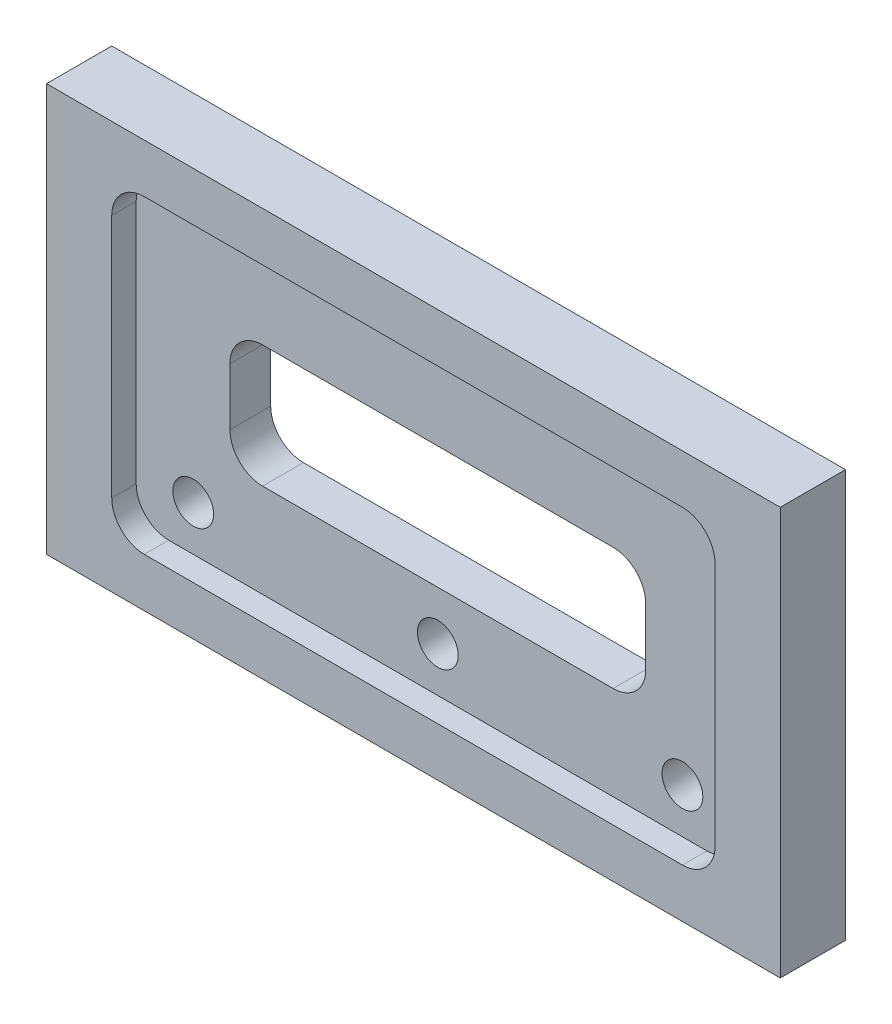
ISO-10303-21;
HEADER;
FILE_DESCRIPTION(('STEP AP214'),'2;1');
FILE_NAME('part.step','',(''),(''),'','','');
FILE_SCHEMA(('AUTOMOTIVE_DESIGN { 1 0 10303 214 1 1 1 1 }'));
ENDSEC;
DATA;
#1=APPLICATION_CONTEXT('core data for automotive mechanical design processes');
#2=APPLICATION_PROTOCOL_DEFINITION('international standard','automotive_design',2000,#1);
#3=PRODUCT_CONTEXT('',#1,'mechanical');
#4=PRODUCT('Part','Part','',(#3));
#5=PRODUCT_RELATED_PRODUCT_CATEGORY('part','',(#4));
#6=PRODUCT_DEFINITION_FORMATION('','',#4);
#7=PRODUCT_DEFINITION_CONTEXT('part definition',#1,'design');
#8=PRODUCT_DEFINITION('design','',#6,#7);
#9=PRODUCT_DEFINITION_SHAPE('','',#8);
#10=(LENGTH_UNIT() NAMED_UNIT(*) SI_UNIT(.MILLI.,.METRE.));
#11=(NAMED_UNIT(*) PLANE_ANGLE_UNIT() SI_UNIT($,.RADIAN.));
#12=(NAMED_UNIT(*) SI_UNIT($,.STERADIAN.) SOLID_ANGLE_UNIT());
#13=UNCERTAINTY_MEASURE_WITH_UNIT(LENGTH_MEASURE(1.E-05),#10,'distance_accuracy_value','');
#14=(GEOMETRIC_REPRESENTATION_CONTEXT(3) GLOBAL_UNCERTAINTY_ASSIGNED_CONTEXT((#13)) GLOBAL_UNIT_ASSIGNED_CONTEXT((#10,
#11,#12)) REPRESENTATION_CONTEXT('',''));
#15=CARTESIAN_POINT('',(0.,0.,0.));
#16=DIRECTION('',(0.,0.,1.));
#17=DIRECTION('',(1.,0.,0.));
#18=AXIS2_PLACEMENT_3D('',#15,#16,#17);
#19=CARTESIAN_POINT('',(0.,0.,2.5));
#20=DIRECTION('',(0.,0.,-1.));
#21=DIRECTION('',(-1.,0.,0.));
#22=AXIS2_PLACEMENT_3D('',#19,#20,#21);
#23=PLANE('',#22);
#24=CARTESIAN_POINT('',(-15.,-6.75,2.5));
#25=DIRECTION('',(0.,0.,1.));
#26=DIRECTION('',(1.,0.,0.));
#27=AXIS2_PLACEMENT_3D('',#24,#25,#26);
#28=CIRCLE('',#27,1.24999999999999);
#29=CARTESIAN_POINT('',(-13.75,-6.75,2.5));
#30=VERTEX_POINT('',#29);
#31=EDGE_CURVE('E547',#30,#30,#28,.T.);
#32=ORIENTED_EDGE('',*,*,#31,.F.);
#33=EDGE_LOOP('',(#32));
#34=FACE_BOUND('',#33,.T.);
#35=CARTESIAN_POINT('',(0.,-6.75,2.5));
#36=DIRECTION('',(0.,0.,1.));
#37=DIRECTION('',(1.,0.,0.));
#38=AXIS2_PLACEMENT_3D('',#35,#36,#37);
#39=CIRCLE('',#38,1.24999999999999);
#40=CARTESIAN_POINT('',(1.24999999999999,-6.75,2.5));
#41=VERTEX_POINT('',#40);
#42=EDGE_CURVE('E549',#41,#41,#39,.T.);
#43=ORIENTED_EDGE('',*,*,#42,.F.);
#44=EDGE_LOOP('',(#43));
#45=FACE_BOUND('',#44,.T.);
#46=DIRECTION('',(-1.,0.,0.));
#47=VECTOR('',#46,1.);
#48=CARTESIAN_POINT('',(-10.75,3.75,2.5));
#49=LINE('',#48,#47);
#50=CARTESIAN_POINT('',(10.75,3.75,2.5));
#51=VERTEX_POINT('',#50);
#52=CARTESIAN_POINT('',(-10.75,3.75,2.5));
#53=VERTEX_POINT('',#52);
#54=EDGE_CURVE('E211',#51,#53,#49,.T.);
#55=ORIENTED_EDGE('',*,*,#54,.F.);
#56=CARTESIAN_POINT('',(10.75,1.75,2.5));
#57=DIRECTION('',(0.,0.,1.));
#58=DIRECTION('',(-1.,0.,0.));
#59=AXIS2_PLACEMENT_3D('',#56,#57,#58);
#60=CIRCLE('',#59,2.);
#61=CARTESIAN_POINT('',(12.75,1.74999999999999,2.5));
#62=VERTEX_POINT('',#61);
#63=EDGE_CURVE('E56',#62,#51,#60,.T.);
#64=ORIENTED_EDGE('',*,*,#63,.F.);
#65=DIRECTION('',(0.,1.,0.));
#66=VECTOR('',#65,1.);
#67=CARTESIAN_POINT('',(12.75,-1.74999999999999,2.5));
#68=LINE('',#67,#66);
#69=CARTESIAN_POINT('',(12.75,-1.75,2.5));
#70=VERTEX_POINT('',#69);
#71=EDGE_CURVE('E188',#70,#62,#68,.T.);
#72=ORIENTED_EDGE('',*,*,#71,.F.);
#73=CARTESIAN_POINT('',(10.75,-1.75,2.5));
#74=DIRECTION('',(0.,0.,1.));
#75=DIRECTION('',(1.,0.,0.));
#76=AXIS2_PLACEMENT_3D('',#73,#74,#75);
#77=CIRCLE('',#76,2.);
#78=CARTESIAN_POINT('',(10.75,-3.75,2.5));
#79=VERTEX_POINT('',#78);
#80=EDGE_CURVE('E191',#79,#70,#77,.T.);
#81=ORIENTED_EDGE('',*,*,#80,.F.);
#82=DIRECTION('',(1.,0.,0.));
#83=VECTOR('',#82,1.);
#84=CARTESIAN_POINT('',(-10.75,-3.75,2.5));
#85=LINE('',#84,#83);
#86=CARTESIAN_POINT('',(-10.75,-3.75,2.5));
#87=VERTEX_POINT('',#86);
#88=EDGE_CURVE('E222',#87,#79,#85,.T.);
#89=ORIENTED_EDGE('',*,*,#88,.F.);
#90=CARTESIAN_POINT('',(-10.75,-1.75,2.5));
#91=DIRECTION('',(0.,0.,1.));
#92=DIRECTION('',(-1.,0.,0.));
#93=AXIS2_PLACEMENT_3D('',#90,#91,#92);
#94=CIRCLE('',#93,2.);
#95=CARTESIAN_POINT('',(-12.75,-1.74999999999999,2.5));
#96=VERTEX_POINT('',#95);
#97=EDGE_CURVE('E219',#96,#87,#94,.T.);
#98=ORIENTED_EDGE('',*,*,#97,.F.);
#99=DIRECTION('',(0.,-1.,0.));
#100=VECTOR('',#99,1.);
#101=CARTESIAN_POINT('',(-12.75,-1.74999999999999,2.5));
#102=LINE('',#101,#100);
#103=CARTESIAN_POINT('',(-12.75,1.74999999999999,2.5));
#104=VERTEX_POINT('',#103);
#105=EDGE_CURVE('E216',#104,#96,#102,.T.);
#106=ORIENTED_EDGE('',*,*,#105,.F.);
#107=CARTESIAN_POINT('',(-10.75,1.75,2.5));
#108=DIRECTION('',(0.,0.,1.));
#109=DIRECTION('',(-1.,0.,0.));
#110=AXIS2_PLACEMENT_3D('',#107,#108,#109);
#111=CIRCLE('',#110,2.);
#112=EDGE_CURVE('E213',#53,#104,#111,.T.);
#113=ORIENTED_EDGE('',*,*,#112,.F.);
#114=EDGE_LOOP('',(#55,#64,#72,#81,#89,#98,#106,#113));
#115=FACE_BOUND('',#114,.T.);
#116=DIRECTION('',(-1.,0.,0.));
#117=VECTOR('',#116,1.);
#118=CARTESIAN_POINT('',(-18.5,9.5,2.5));
#119=LINE('',#118,#117);
#120=CARTESIAN_POINT('',(16.5,9.5,2.5));
#121=VERTEX_POINT('',#120);
#122=CARTESIAN_POINT('',(-16.5,9.5,2.5));
#123=VERTEX_POINT('',#122);
#124=EDGE_CURVE('E244',#121,#123,#119,.T.);
#125=ORIENTED_EDGE('',*,*,#124,.T.);
#126=CARTESIAN_POINT('',(-16.5,7.5,2.5));
#127=DIRECTION('',(0.,0.,-1.));
#128=DIRECTION('',(-1.,0.,0.));
#129=AXIS2_PLACEMENT_3D('',#126,#127,#128);
#130=CIRCLE('',#129,2.);
#131=CARTESIAN_POINT('',(-18.5,7.5,2.5));
#132=VERTEX_POINT('',#131);
#133=EDGE_CURVE('E310',#123,#132,#130,.F.);
#134=ORIENTED_EDGE('',*,*,#133,.T.);
#135=DIRECTION('',(0.,-1.,0.));
#136=VECTOR('',#135,1.);
#137=CARTESIAN_POINT('',(-18.5,-9.5,2.5));
#138=LINE('',#137,#136);
#139=CARTESIAN_POINT('',(-18.5,-7.5,2.5));
#140=VERTEX_POINT('',#139);
#141=EDGE_CURVE('E248',#132,#140,#138,.T.);
#142=ORIENTED_EDGE('',*,*,#141,.T.);
#143=CARTESIAN_POINT('',(-16.5,-7.5,2.5));
#144=DIRECTION('',(0.,0.,-1.));
#145=DIRECTION('',(-1.,0.,0.));
#146=AXIS2_PLACEMENT_3D('',#143,#144,#145);
#147=CIRCLE('',#146,2.);
#148=CARTESIAN_POINT('',(-16.5,-9.5,2.5));
#149=VERTEX_POINT('',#148);
#150=EDGE_CURVE('E304',#140,#149,#147,.F.);
#151=ORIENTED_EDGE('',*,*,#150,.T.);
#152=DIRECTION('',(1.,0.,0.));
#153=VECTOR('',#152,1.);
#154=CARTESIAN_POINT('',(-18.5,-9.5,2.5));
#155=LINE('',#154,#153);
#156=CARTESIAN_POINT('',(16.5,-9.5,2.5));
#157=VERTEX_POINT('',#156);
#158=EDGE_CURVE('E251',#149,#157,#155,.T.);
#159=ORIENTED_EDGE('',*,*,#158,.T.);
#160=CARTESIAN_POINT('',(16.5,-7.5,2.5));
#161=DIRECTION('',(0.,0.,-1.));
#162=DIRECTION('',(-1.,0.,0.));
#163=AXIS2_PLACEMENT_3D('',#160,#161,#162);
#164=CIRCLE('',#163,2.);
#165=CARTESIAN_POINT('',(18.5,-7.5,2.5));
#166=VERTEX_POINT('',#165);
#167=EDGE_CURVE('E306',#157,#166,#164,.F.);
#168=ORIENTED_EDGE('',*,*,#167,.T.);
#169=DIRECTION('',(0.,1.,0.));
#170=VECTOR('',#169,1.);
#171=CARTESIAN_POINT('',(18.5,-9.5,2.5));
#172=LINE('',#171,#170);
#173=CARTESIAN_POINT('',(18.5,7.5,2.5));
#174=VERTEX_POINT('',#173);
#175=EDGE_CURVE('E241',#166,#174,#172,.T.);
#176=ORIENTED_EDGE('',*,*,#175,.T.);
#177=CARTESIAN_POINT('',(16.5,7.5,2.5));
#178=DIRECTION('',(0.,0.,-1.));
#179=DIRECTION('',(-1.,0.,0.));
#180=AXIS2_PLACEMENT_3D('',#177,#178,#179);
#181=CIRCLE('',#180,2.);
#182=EDGE_CURVE('E308',#174,#121,#181,.F.);
#183=ORIENTED_EDGE('',*,*,#182,.T.);
#184=EDGE_LOOP('',(#125,#134,#142,#151,#159,#168,#176,#183));
#185=FACE_BOUND('',#184,.T.);
#186=CARTESIAN_POINT('',(15.,-6.75,2.5));
#187=DIRECTION('',(0.,0.,1.));
#188=DIRECTION('',(1.,0.,0.));
#189=AXIS2_PLACEMENT_3D('',#186,#187,#188);
#190=CIRCLE('',#189,1.24999999999999);
#191=CARTESIAN_POINT('',(16.25,-6.75,2.5));
#192=VERTEX_POINT('',#191);
#193=EDGE_CURVE('E556',#192,#192,#190,.T.);
#194=ORIENTED_EDGE('',*,*,#193,.F.);
#195=EDGE_LOOP('',(#194));
#196=FACE_BOUND('',#195,.T.);
#197=ADVANCED_FACE('F33',(#34,#45,#115,#185,#196),#23,.F.);
#198=CARTESIAN_POINT('',(22.5,-12.5,4.));
#199=DIRECTION('',(-1.,0.,0.));
#200=DIRECTION('',(0.,-1.,0.));
#201=AXIS2_PLACEMENT_3D('',#198,#199,#200);
#202=PLANE('',#201);
#203=DIRECTION('',(0.,1.,0.));
#204=VECTOR('',#203,1.);
#205=CARTESIAN_POINT('',(22.5,-12.5,0.));
#206=LINE('',#205,#204);
#207=CARTESIAN_POINT('',(22.5,-12.5,0.));
#208=VERTEX_POINT('',#207);
#209=CARTESIAN_POINT('',(22.5,12.5,0.));
#210=VERTEX_POINT('',#209);
#211=EDGE_CURVE('E254',#208,#210,#206,.T.);
#212=ORIENTED_EDGE('',*,*,#211,.T.);
#213=DIRECTION('',(0.,0.,-1.));
#214=VECTOR('',#213,1.);
#215=CARTESIAN_POINT('',(22.5,12.5,4.));
#216=LINE('',#215,#214);
#217=CARTESIAN_POINT('',(22.5,12.5,4.));
#218=VERTEX_POINT('',#217);
#219=EDGE_CURVE('E291',#218,#210,#216,.T.);
#220=ORIENTED_EDGE('',*,*,#219,.F.);
#221=DIRECTION('',(0.,1.,0.));
#222=VECTOR('',#221,1.);
#223=CARTESIAN_POINT('',(22.5,-12.5,4.));
#224=LINE('',#223,#222);
#225=CARTESIAN_POINT('',(22.5,-12.5,4.));
#226=VERTEX_POINT('',#225);
#227=EDGE_CURVE('E265',#226,#218,#224,.T.);
#228=ORIENTED_EDGE('',*,*,#227,.F.);
#229=DIRECTION('',(0.,0.,-1.));
#230=VECTOR('',#229,1.);
#231=CARTESIAN_POINT('',(22.5,-12.5,4.));
#232=LINE('',#231,#230);
#233=EDGE_CURVE('E275',#226,#208,#232,.T.);
#234=ORIENTED_EDGE('',*,*,#233,.T.);
#235=EDGE_LOOP('',(#212,#220,#228,#234));
#236=FACE_BOUND('',#235,.T.);
#237=ADVANCED_FACE('F373',(#236),#202,.F.);
#238=CARTESIAN_POINT('',(-22.5,12.5,4.));
#239=DIRECTION('',(0.,-1.,0.));
#240=DIRECTION('',(0.,0.,-1.));
#241=AXIS2_PLACEMENT_3D('',#238,#239,#240);
#242=PLANE('',#241);
#243=DIRECTION('',(-1.,0.,0.));
#244=VECTOR('',#243,1.);
#245=CARTESIAN_POINT('',(-22.5,12.5,0.));
#246=LINE('',#245,#244);
#247=CARTESIAN_POINT('',(-22.5,12.5,0.));
#248=VERTEX_POINT('',#247);
#249=EDGE_CURVE('E278',#210,#248,#246,.T.);
#250=ORIENTED_EDGE('',*,*,#249,.T.);
#251=DIRECTION('',(0.,0.,-1.));
#252=VECTOR('',#251,1.);
#253=CARTESIAN_POINT('',(-22.5,12.5,4.));
#254=LINE('',#253,#252);
#255=CARTESIAN_POINT('',(-22.5,12.5,4.));
#256=VERTEX_POINT('',#255);
#257=EDGE_CURVE('E288',#256,#248,#254,.T.);
#258=ORIENTED_EDGE('',*,*,#257,.F.);
#259=DIRECTION('',(-1.,0.,0.));
#260=VECTOR('',#259,1.);
#261=CARTESIAN_POINT('',(-22.5,12.5,4.));
#262=LINE('',#261,#260);
#263=EDGE_CURVE('E268',#218,#256,#262,.T.);
#264=ORIENTED_EDGE('',*,*,#263,.F.);
#265=ORIENTED_EDGE('',*,*,#219,.T.);
#266=EDGE_LOOP('',(#250,#258,#264,#265));
#267=FACE_BOUND('',#266,.T.);
#268=ADVANCED_FACE('F379',(#267),#242,.F.);
#269=CARTESIAN_POINT('',(-22.5,-12.5,4.));
#270=DIRECTION('',(1.,0.,0.));
#271=DIRECTION('',(0.,0.,-1.));
#272=AXIS2_PLACEMENT_3D('',#269,#270,#271);
#273=PLANE('',#272);
#274=DIRECTION('',(0.,-1.,0.));
#275=VECTOR('',#274,1.);
#276=CARTESIAN_POINT('',(-22.5,-12.5,0.));
#277=LINE('',#276,#275);
#278=CARTESIAN_POINT('',(-22.5,-12.5,0.));
#279=VERTEX_POINT('',#278);
#280=EDGE_CURVE('E280',#248,#279,#277,.T.);
#281=ORIENTED_EDGE('',*,*,#280,.T.);
#282=DIRECTION('',(0.,0.,-1.));
#283=VECTOR('',#282,1.);
#284=CARTESIAN_POINT('',(-22.5,-12.5,4.));
#285=LINE('',#284,#283);
#286=CARTESIAN_POINT('',(-22.5,-12.5,4.));
#287=VERTEX_POINT('',#286);
#288=EDGE_CURVE('E285',#287,#279,#285,.T.);
#289=ORIENTED_EDGE('',*,*,#288,.F.);
#290=DIRECTION('',(0.,-1.,0.));
#291=VECTOR('',#290,1.);
#292=CARTESIAN_POINT('',(-22.5,-12.5,4.));
#293=LINE('',#292,#291);
#294=EDGE_CURVE('E271',#256,#287,#293,.T.);
#295=ORIENTED_EDGE('',*,*,#294,.F.);
#296=ORIENTED_EDGE('',*,*,#257,.T.);
#297=EDGE_LOOP('',(#281,#289,#295,#296));
#298=FACE_BOUND('',#297,.T.);
#299=ADVANCED_FACE('F402',(#298),#273,.F.);
#300=CARTESIAN_POINT('',(-22.5,-12.5,4.));
#301=DIRECTION('',(0.,1.,0.));
#302=DIRECTION('',(0.,0.,1.));
#303=AXIS2_PLACEMENT_3D('',#300,#301,#302);
#304=PLANE('',#303);
#305=DIRECTION('',(1.,0.,0.));
#306=VECTOR('',#305,1.);
#307=CARTESIAN_POINT('',(-22.5,-12.5,0.));
#308=LINE('',#307,#306);
#309=EDGE_CURVE('E269',#279,#208,#308,.T.);
#310=ORIENTED_EDGE('',*,*,#309,.T.);
#311=ORIENTED_EDGE('',*,*,#233,.F.);
#312=DIRECTION('',(1.,0.,0.));
#313=VECTOR('',#312,1.);
#314=CARTESIAN_POINT('',(-22.5,-12.5,4.));
#315=LINE('',#314,#313);
#316=EDGE_CURVE('E273',#287,#226,#315,.T.);
#317=ORIENTED_EDGE('',*,*,#316,.F.);
#318=ORIENTED_EDGE('',*,*,#288,.T.);
#319=EDGE_LOOP('',(#310,#311,#317,#318));
#320=FACE_BOUND('',#319,.T.);
#321=ADVANCED_FACE('F396',(#320),#304,.F.);
#322=CARTESIAN_POINT('',(0.,0.,4.));
#323=DIRECTION('',(0.,0.,-1.));
#324=DIRECTION('',(-1.,0.,0.));
#325=AXIS2_PLACEMENT_3D('',#322,#323,#324);
#326=PLANE('',#325);
#327=DIRECTION('',(-1.,0.,0.));
#328=VECTOR('',#327,1.);
#329=CARTESIAN_POINT('',(-18.5,9.5,4.));
#330=LINE('',#329,#328);
#331=CARTESIAN_POINT('',(16.5,9.5,4.));
#332=VERTEX_POINT('',#331);
#333=CARTESIAN_POINT('',(-16.5,9.5,4.));
#334=VERTEX_POINT('',#333);
#335=EDGE_CURVE('E257',#332,#334,#330,.T.);
#336=ORIENTED_EDGE('',*,*,#335,.F.);
#337=CARTESIAN_POINT('',(16.5,7.5,4.));
#338=DIRECTION('',(0.,0.,-1.));
#339=DIRECTION('',(-1.,0.,0.));
#340=AXIS2_PLACEMENT_3D('',#337,#338,#339);
#341=CIRCLE('',#340,2.);
#342=CARTESIAN_POINT('',(18.5,7.5,4.));
#343=VERTEX_POINT('',#342);
#344=EDGE_CURVE('E324',#332,#343,#341,.T.);
#345=ORIENTED_EDGE('',*,*,#344,.T.);
#346=DIRECTION('',(0.,1.,0.));
#347=VECTOR('',#346,1.);
#348=CARTESIAN_POINT('',(18.5,-9.5,4.));
#349=LINE('',#348,#347);
#350=CARTESIAN_POINT('',(18.5,-7.5,4.));
#351=VERTEX_POINT('',#350);
#352=EDGE_CURVE('E229',#351,#343,#349,.T.);
#353=ORIENTED_EDGE('',*,*,#352,.F.);
#354=CARTESIAN_POINT('',(16.5,-7.5,4.));
#355=DIRECTION('',(0.,0.,-1.));
#356=DIRECTION('',(-1.,0.,0.));
#357=AXIS2_PLACEMENT_3D('',#354,#355,#356);
#358=CIRCLE('',#357,2.);
#359=CARTESIAN_POINT('',(16.5,-9.5,4.));
#360=VERTEX_POINT('',#359);
#361=EDGE_CURVE('E41',#351,#360,#358,.T.);
#362=ORIENTED_EDGE('',*,*,#361,.T.);
#363=DIRECTION('',(1.,0.,0.));
#364=VECTOR('',#363,1.);
#365=CARTESIAN_POINT('',(-18.5,-9.5,4.));
#366=LINE('',#365,#364);
#367=CARTESIAN_POINT('',(-16.5,-9.5,4.));
#368=VERTEX_POINT('',#367);
#369=EDGE_CURVE('E245',#368,#360,#366,.T.);
#370=ORIENTED_EDGE('',*,*,#369,.F.);
#371=CARTESIAN_POINT('',(-16.5,-7.5,4.));
#372=DIRECTION('',(0.,0.,-1.));
#373=DIRECTION('',(-1.,0.,0.));
#374=AXIS2_PLACEMENT_3D('',#371,#372,#373);
#375=CIRCLE('',#374,2.);
#376=CARTESIAN_POINT('',(-18.5,-7.5,4.));
#377=VERTEX_POINT('',#376);
#378=EDGE_CURVE('E11',#368,#377,#375,.T.);
#379=ORIENTED_EDGE('',*,*,#378,.T.);
#380=DIRECTION('',(0.,-1.,0.));
#381=VECTOR('',#380,1.);
#382=CARTESIAN_POINT('',(-18.5,-9.5,4.));
#383=LINE('',#382,#381);
#384=CARTESIAN_POINT('',(-18.5,7.5,4.));
#385=VERTEX_POINT('',#384);
#386=EDGE_CURVE('E260',#385,#377,#383,.T.);
#387=ORIENTED_EDGE('',*,*,#386,.F.);
#388=CARTESIAN_POINT('',(-16.5,7.5,4.));
#389=DIRECTION('',(0.,0.,-1.));
#390=DIRECTION('',(-1.,0.,0.));
#391=AXIS2_PLACEMENT_3D('',#388,#389,#390);
#392=CIRCLE('',#391,2.);
#393=EDGE_CURVE('E322',#385,#334,#392,.T.);
#394=ORIENTED_EDGE('',*,*,#393,.T.);
#395=EDGE_LOOP('',(#336,#345,#353,#362,#370,#379,#387,#394));
#396=FACE_BOUND('',#395,.T.);
#397=ORIENTED_EDGE('',*,*,#227,.T.);
#398=ORIENTED_EDGE('',*,*,#263,.T.);
#399=ORIENTED_EDGE('',*,*,#294,.T.);
#400=ORIENTED_EDGE('',*,*,#316,.T.);
#401=EDGE_LOOP('',(#397,#398,#399,#400));
#402=FACE_BOUND('',#401,.T.);
#403=ADVANCED_FACE('F329',(#396,#402),#326,.F.);
#404=CARTESIAN_POINT('',(0.,0.,0.));
#405=DIRECTION('',(0.,0.,-1.));
#406=DIRECTION('',(-1.,0.,0.));
#407=AXIS2_PLACEMENT_3D('',#404,#405,#406);
#408=PLANE('',#407);
#409=CARTESIAN_POINT('',(-15.,-6.75,0.));
#410=DIRECTION('',(0.,0.,1.));
#411=DIRECTION('',(1.,0.,0.));
#412=AXIS2_PLACEMENT_3D('',#409,#410,#411);
#413=CIRCLE('',#412,1.25);
#414=CARTESIAN_POINT('',(-13.75,-6.75,0.));
#415=VERTEX_POINT('',#414);
#416=EDGE_CURVE('E545',#415,#415,#413,.T.);
#417=ORIENTED_EDGE('',*,*,#416,.T.);
#418=EDGE_LOOP('',(#417));
#419=FACE_BOUND('',#418,.T.);
#420=CARTESIAN_POINT('',(0.,-6.75,0.));
#421=DIRECTION('',(0.,0.,1.));
#422=DIRECTION('',(1.,0.,0.));
#423=AXIS2_PLACEMENT_3D('',#420,#421,#422);
#424=CIRCLE('',#423,1.25);
#425=CARTESIAN_POINT('',(1.25,-6.75,0.));
#426=VERTEX_POINT('',#425);
#427=EDGE_CURVE('E554',#426,#426,#424,.T.);
#428=ORIENTED_EDGE('',*,*,#427,.T.);
#429=EDGE_LOOP('',(#428));
#430=FACE_BOUND('',#429,.T.);
#431=CARTESIAN_POINT('',(15.,-6.75,0.));
#432=DIRECTION('',(0.,0.,1.));
#433=DIRECTION('',(1.,0.,0.));
#434=AXIS2_PLACEMENT_3D('',#431,#432,#433);
#435=CIRCLE('',#434,1.25);
#436=CARTESIAN_POINT('',(16.25,-6.75,0.));
#437=VERTEX_POINT('',#436);
#438=EDGE_CURVE('E194',#437,#437,#435,.T.);
#439=ORIENTED_EDGE('',*,*,#438,.T.);
#440=EDGE_LOOP('',(#439));
#441=FACE_BOUND('',#440,.T.);
#442=CARTESIAN_POINT('',(10.75,1.75,0.));
#443=DIRECTION('',(0.,0.,1.));
#444=DIRECTION('',(-1.,0.,0.));
#445=AXIS2_PLACEMENT_3D('',#442,#443,#444);
#446=CIRCLE('',#445,2.);
#447=CARTESIAN_POINT('',(12.75,1.74999999999999,0.));
#448=VERTEX_POINT('',#447);
#449=CARTESIAN_POINT('',(10.75,3.75,0.));
#450=VERTEX_POINT('',#449);
#451=EDGE_CURVE('E171',#448,#450,#446,.T.);
#452=ORIENTED_EDGE('',*,*,#451,.T.);
#453=DIRECTION('',(-1.,0.,0.));
#454=VECTOR('',#453,1.);
#455=CARTESIAN_POINT('',(-10.75,3.75,0.));
#456=LINE('',#455,#454);
#457=CARTESIAN_POINT('',(-10.75,3.75,0.));
#458=VERTEX_POINT('',#457);
#459=EDGE_CURVE('E180',#450,#458,#456,.T.);
#460=ORIENTED_EDGE('',*,*,#459,.T.);
#461=CARTESIAN_POINT('',(-10.75,1.75,0.));
#462=DIRECTION('',(0.,0.,1.));
#463=DIRECTION('',(-1.,0.,0.));
#464=AXIS2_PLACEMENT_3D('',#461,#462,#463);
#465=CIRCLE('',#464,2.);
#466=CARTESIAN_POINT('',(-12.75,1.74999999999999,0.));
#467=VERTEX_POINT('',#466);
#468=EDGE_CURVE('E48',#458,#467,#465,.T.);
#469=ORIENTED_EDGE('',*,*,#468,.T.);
#470=DIRECTION('',(0.,-1.,0.));
#471=VECTOR('',#470,1.);
#472=CARTESIAN_POINT('',(-12.75,-1.74999999999999,0.));
#473=LINE('',#472,#471);
#474=CARTESIAN_POINT('',(-12.75,-1.74999999999999,0.));
#475=VERTEX_POINT('',#474);
#476=EDGE_CURVE('E198',#467,#475,#473,.T.);
#477=ORIENTED_EDGE('',*,*,#476,.T.);
#478=CARTESIAN_POINT('',(-10.75,-1.75,0.));
#479=DIRECTION('',(0.,0.,1.));
#480=DIRECTION('',(-1.,0.,0.));
#481=AXIS2_PLACEMENT_3D('',#478,#479,#480);
#482=CIRCLE('',#481,2.);
#483=CARTESIAN_POINT('',(-10.75,-3.75,0.));
#484=VERTEX_POINT('',#483);
#485=EDGE_CURVE('E201',#475,#484,#482,.T.);
#486=ORIENTED_EDGE('',*,*,#485,.T.);
#487=DIRECTION('',(1.,0.,0.));
#488=VECTOR('',#487,1.);
#489=CARTESIAN_POINT('',(-10.75,-3.75,0.));
#490=LINE('',#489,#488);
#491=CARTESIAN_POINT('',(10.75,-3.75,0.));
#492=VERTEX_POINT('',#491);
#493=EDGE_CURVE('E204',#484,#492,#490,.T.);
#494=ORIENTED_EDGE('',*,*,#493,.T.);
#495=CARTESIAN_POINT('',(10.75,-1.75,0.));
#496=DIRECTION('',(0.,0.,1.));
#497=DIRECTION('',(1.,0.,0.));
#498=AXIS2_PLACEMENT_3D('',#495,#496,#497);
#499=CIRCLE('',#498,2.);
#500=CARTESIAN_POINT('',(12.75,-1.75,0.));
#501=VERTEX_POINT('',#500);
#502=EDGE_CURVE('E207',#492,#501,#499,.T.);
#503=ORIENTED_EDGE('',*,*,#502,.T.);
#504=DIRECTION('',(0.,1.,0.));
#505=VECTOR('',#504,1.);
#506=CARTESIAN_POINT('',(12.75,-1.74999999999999,0.));
#507=LINE('',#506,#505);
#508=EDGE_CURVE('E177',#501,#448,#507,.T.);
#509=ORIENTED_EDGE('',*,*,#508,.T.);
#510=EDGE_LOOP('',(#452,#460,#469,#477,#486,#494,#503,#509));
#511=FACE_BOUND('',#510,.T.);
#512=ORIENTED_EDGE('',*,*,#211,.F.);
#513=ORIENTED_EDGE('',*,*,#309,.F.);
#514=ORIENTED_EDGE('',*,*,#280,.F.);
#515=ORIENTED_EDGE('',*,*,#249,.F.);
#516=EDGE_LOOP('',(#512,#513,#514,#515));
#517=FACE_BOUND('',#516,.T.);
#518=ADVANCED_FACE('F184',(#419,#430,#441,#511,#517),#408,.T.);
#519=CARTESIAN_POINT('',(18.5,-9.5,2.5));
#520=DIRECTION('',(1.,0.,0.));
#521=DIRECTION('',(0.,0.,-1.));
#522=AXIS2_PLACEMENT_3D('',#519,#520,#521);
#523=PLANE('',#522);
#524=ORIENTED_EDGE('',*,*,#352,.T.);
#525=DIRECTION('',(0.,0.,1.));
#526=VECTOR('',#525,1.);
#527=CARTESIAN_POINT('',(18.5,7.5,2.5));
#528=LINE('',#527,#526);
#529=EDGE_CURVE('E315',#343,#174,#528,.F.);
#530=ORIENTED_EDGE('',*,*,#529,.T.);
#531=ORIENTED_EDGE('',*,*,#175,.F.);
#532=DIRECTION('',(0.,0.,1.));
#533=VECTOR('',#532,1.);
#534=CARTESIAN_POINT('',(18.5,-7.5,4.));
#535=LINE('',#534,#533);
#536=EDGE_CURVE('E312',#166,#351,#535,.T.);
#537=ORIENTED_EDGE('',*,*,#536,.T.);
#538=EDGE_LOOP('',(#524,#530,#531,#537));
#539=FACE_BOUND('',#538,.T.);
#540=ADVANCED_FACE('F345',(#539),#523,.F.);
#541=CARTESIAN_POINT('',(-18.5,-9.5,2.5));
#542=DIRECTION('',(0.,-1.,0.));
#543=DIRECTION('',(0.,0.,-1.));
#544=AXIS2_PLACEMENT_3D('',#541,#542,#543);
#545=PLANE('',#544);
#546=ORIENTED_EDGE('',*,*,#369,.T.);
#547=DIRECTION('',(0.,0.,1.));
#548=VECTOR('',#547,1.);
#549=CARTESIAN_POINT('',(16.5,-9.5,2.5));
#550=LINE('',#549,#548);
#551=EDGE_CURVE('E320',#360,#157,#550,.F.);
#552=ORIENTED_EDGE('',*,*,#551,.T.);
#553=ORIENTED_EDGE('',*,*,#158,.F.);
#554=DIRECTION('',(0.,0.,1.));
#555=VECTOR('',#554,1.);
#556=CARTESIAN_POINT('',(-16.5,-9.5,4.));
#557=LINE('',#556,#555);
#558=EDGE_CURVE('E317',#149,#368,#557,.T.);
#559=ORIENTED_EDGE('',*,*,#558,.T.);
#560=EDGE_LOOP('',(#546,#552,#553,#559));
#561=FACE_BOUND('',#560,.T.);
#562=ADVANCED_FACE('F335',(#561),#545,.F.);
#563=CARTESIAN_POINT('',(-18.5,-9.5,2.5));
#564=DIRECTION('',(-1.,0.,0.));
#565=DIRECTION('',(0.,0.,1.));
#566=AXIS2_PLACEMENT_3D('',#563,#564,#565);
#567=PLANE('',#566);
#568=ORIENTED_EDGE('',*,*,#141,.F.);
#569=DIRECTION('',(0.,0.,1.));
#570=VECTOR('',#569,1.);
#571=CARTESIAN_POINT('',(-18.5,7.5,4.));
#572=LINE('',#571,#570);
#573=EDGE_CURVE('E296',#132,#385,#572,.T.);
#574=ORIENTED_EDGE('',*,*,#573,.T.);
#575=ORIENTED_EDGE('',*,*,#386,.T.);
#576=DIRECTION('',(0.,0.,1.));
#577=VECTOR('',#576,1.);
#578=CARTESIAN_POINT('',(-18.5,-7.5,2.5));
#579=LINE('',#578,#577);
#580=EDGE_CURVE('E294',#377,#140,#579,.F.);
#581=ORIENTED_EDGE('',*,*,#580,.T.);
#582=EDGE_LOOP('',(#568,#574,#575,#581));
#583=FACE_BOUND('',#582,.T.);
#584=ADVANCED_FACE('F361',(#583),#567,.F.);
#585=CARTESIAN_POINT('',(-18.5,9.5,2.5));
#586=DIRECTION('',(0.,1.,0.));
#587=DIRECTION('',(0.,0.,1.));
#588=AXIS2_PLACEMENT_3D('',#585,#586,#587);
#589=PLANE('',#588);
#590=ORIENTED_EDGE('',*,*,#335,.T.);
#591=DIRECTION('',(0.,0.,1.));
#592=VECTOR('',#591,1.);
#593=CARTESIAN_POINT('',(-16.5,9.5,2.5));
#594=LINE('',#593,#592);
#595=EDGE_CURVE('E302',#334,#123,#594,.F.);
#596=ORIENTED_EDGE('',*,*,#595,.T.);
#597=ORIENTED_EDGE('',*,*,#124,.F.);
#598=DIRECTION('',(0.,0.,1.));
#599=VECTOR('',#598,1.);
#600=CARTESIAN_POINT('',(16.5,9.5,4.));
#601=LINE('',#600,#599);
#602=EDGE_CURVE('E299',#121,#332,#601,.T.);
#603=ORIENTED_EDGE('',*,*,#602,.T.);
#604=EDGE_LOOP('',(#590,#596,#597,#603));
#605=FACE_BOUND('',#604,.T.);
#606=ADVANCED_FACE('F353',(#605),#589,.F.);
#607=CARTESIAN_POINT('',(-16.5,7.5,2.5));
#608=DIRECTION('',(0.,0.,-1.));
#609=DIRECTION('',(-1.,0.,0.));
#610=AXIS2_PLACEMENT_3D('',#607,#608,#609);
#611=CYLINDRICAL_SURFACE('',#610,2.);
#612=ORIENTED_EDGE('',*,*,#133,.F.);
#613=ORIENTED_EDGE('',*,*,#595,.F.);
#614=ORIENTED_EDGE('',*,*,#393,.F.);
#615=ORIENTED_EDGE('',*,*,#573,.F.);
#616=EDGE_LOOP('',(#612,#613,#614,#615));
#617=FACE_BOUND('',#616,.T.);
#618=ADVANCED_FACE('F356',(#617),#611,.F.);
#619=CARTESIAN_POINT('',(16.5,7.5,2.5));
#620=DIRECTION('',(0.,0.,-1.));
#621=DIRECTION('',(-1.,0.,0.));
#622=AXIS2_PLACEMENT_3D('',#619,#620,#621);
#623=CYLINDRICAL_SURFACE('',#622,2.);
#624=ORIENTED_EDGE('',*,*,#182,.F.);
#625=ORIENTED_EDGE('',*,*,#529,.F.);
#626=ORIENTED_EDGE('',*,*,#344,.F.);
#627=ORIENTED_EDGE('',*,*,#602,.F.);
#628=EDGE_LOOP('',(#624,#625,#626,#627));
#629=FACE_BOUND('',#628,.T.);
#630=ADVANCED_FACE('F348',(#629),#623,.F.);
#631=CARTESIAN_POINT('',(16.5,-7.5,2.5));
#632=DIRECTION('',(0.,0.,-1.));
#633=DIRECTION('',(-1.,0.,0.));
#634=AXIS2_PLACEMENT_3D('',#631,#632,#633);
#635=CYLINDRICAL_SURFACE('',#634,2.);
#636=ORIENTED_EDGE('',*,*,#167,.F.);
#637=ORIENTED_EDGE('',*,*,#551,.F.);
#638=ORIENTED_EDGE('',*,*,#361,.F.);
#639=ORIENTED_EDGE('',*,*,#536,.F.);
#640=EDGE_LOOP('',(#636,#637,#638,#639));
#641=FACE_BOUND('',#640,.T.);
#642=ADVANCED_FACE('F339',(#641),#635,.F.);
#643=CARTESIAN_POINT('',(-16.5,-7.5,2.5));
#644=DIRECTION('',(0.,0.,-1.));
#645=DIRECTION('',(-1.,0.,0.));
#646=AXIS2_PLACEMENT_3D('',#643,#644,#645);
#647=CYLINDRICAL_SURFACE('',#646,2.);
#648=ORIENTED_EDGE('',*,*,#150,.F.);
#649=ORIENTED_EDGE('',*,*,#580,.F.);
#650=ORIENTED_EDGE('',*,*,#378,.F.);
#651=ORIENTED_EDGE('',*,*,#558,.F.);
#652=EDGE_LOOP('',(#648,#649,#650,#651));
#653=FACE_BOUND('',#652,.T.);
#654=ADVANCED_FACE('F35',(#653),#647,.F.);
#655=CARTESIAN_POINT('',(10.75,1.75,0.));
#656=DIRECTION('',(0.,0.,1.));
#657=DIRECTION('',(1.,0.,0.));
#658=AXIS2_PLACEMENT_3D('',#655,#656,#657);
#659=CYLINDRICAL_SURFACE('',#658,2.);
#660=ORIENTED_EDGE('',*,*,#63,.T.);
#661=DIRECTION('',(0.,0.,1.));
#662=VECTOR('',#661,1.);
#663=CARTESIAN_POINT('',(10.75,3.75,0.));
#664=LINE('',#663,#662);
#665=EDGE_CURVE('E167',#450,#51,#664,.T.);
#666=ORIENTED_EDGE('',*,*,#665,.F.);
#667=ORIENTED_EDGE('',*,*,#451,.F.);
#668=DIRECTION('',(0.,0.,1.));
#669=VECTOR('',#668,1.);
#670=CARTESIAN_POINT('',(12.75,1.74999999999999,0.));
#671=LINE('',#670,#669);
#672=EDGE_CURVE('E227',#448,#62,#671,.T.);
#673=ORIENTED_EDGE('',*,*,#672,.T.);
#674=EDGE_LOOP('',(#660,#666,#667,#673));
#675=FACE_BOUND('',#674,.T.);
#676=ADVANCED_FACE('F169',(#675),#659,.F.);
#677=CARTESIAN_POINT('',(12.75,-1.74999999999999,0.));
#678=DIRECTION('',(1.,0.,0.));
#679=DIRECTION('',(0.,0.,-1.));
#680=AXIS2_PLACEMENT_3D('',#677,#678,#679);
#681=PLANE('',#680);
#682=ORIENTED_EDGE('',*,*,#71,.T.);
#683=ORIENTED_EDGE('',*,*,#672,.F.);
#684=ORIENTED_EDGE('',*,*,#508,.F.);
#685=DIRECTION('',(0.,0.,1.));
#686=VECTOR('',#685,1.);
#687=CARTESIAN_POINT('',(12.75,-1.75,0.));
#688=LINE('',#687,#686);
#689=EDGE_CURVE('E230',#501,#70,#688,.T.);
#690=ORIENTED_EDGE('',*,*,#689,.T.);
#691=EDGE_LOOP('',(#682,#683,#684,#690));
#692=FACE_BOUND('',#691,.T.);
#693=ADVANCED_FACE('F370',(#692),#681,.F.);
#694=CARTESIAN_POINT('',(10.75,-1.75,0.));
#695=DIRECTION('',(0.,0.,1.));
#696=DIRECTION('',(1.,0.,0.));
#697=AXIS2_PLACEMENT_3D('',#694,#695,#696);
#698=CYLINDRICAL_SURFACE('',#697,2.);
#699=ORIENTED_EDGE('',*,*,#80,.T.);
#700=ORIENTED_EDGE('',*,*,#689,.F.);
#701=ORIENTED_EDGE('',*,*,#502,.F.);
#702=DIRECTION('',(0.,0.,1.));
#703=VECTOR('',#702,1.);
#704=CARTESIAN_POINT('',(10.75,-3.75,0.));
#705=LINE('',#704,#703);
#706=EDGE_CURVE('E232',#492,#79,#705,.T.);
#707=ORIENTED_EDGE('',*,*,#706,.T.);
#708=EDGE_LOOP('',(#699,#700,#701,#707));
#709=FACE_BOUND('',#708,.T.);
#710=ADVANCED_FACE('F440',(#709),#698,.F.);
#711=CARTESIAN_POINT('',(-10.75,-3.75,0.));
#712=DIRECTION('',(0.,-1.,0.));
#713=DIRECTION('',(0.,0.,-1.));
#714=AXIS2_PLACEMENT_3D('',#711,#712,#713);
#715=PLANE('',#714);
#716=ORIENTED_EDGE('',*,*,#88,.T.);
#717=ORIENTED_EDGE('',*,*,#706,.F.);
#718=ORIENTED_EDGE('',*,*,#493,.F.);
#719=DIRECTION('',(0.,0.,1.));
#720=VECTOR('',#719,1.);
#721=CARTESIAN_POINT('',(-10.75,-3.75,0.));
#722=LINE('',#721,#720);
#723=EDGE_CURVE('E234',#484,#87,#722,.T.);
#724=ORIENTED_EDGE('',*,*,#723,.T.);
#725=EDGE_LOOP('',(#716,#717,#718,#724));
#726=FACE_BOUND('',#725,.T.);
#727=ADVANCED_FACE('F450',(#726),#715,.F.);
#728=CARTESIAN_POINT('',(-10.75,-1.75,0.));
#729=DIRECTION('',(0.,0.,1.));
#730=DIRECTION('',(1.,0.,0.));
#731=AXIS2_PLACEMENT_3D('',#728,#729,#730);
#732=CYLINDRICAL_SURFACE('',#731,2.);
#733=ORIENTED_EDGE('',*,*,#97,.T.);
#734=ORIENTED_EDGE('',*,*,#723,.F.);
#735=ORIENTED_EDGE('',*,*,#485,.F.);
#736=DIRECTION('',(0.,0.,1.));
#737=VECTOR('',#736,1.);
#738=CARTESIAN_POINT('',(-12.75,-1.74999999999999,0.));
#739=LINE('',#738,#737);
#740=EDGE_CURVE('E236',#475,#96,#739,.T.);
#741=ORIENTED_EDGE('',*,*,#740,.T.);
#742=EDGE_LOOP('',(#733,#734,#735,#741));
#743=FACE_BOUND('',#742,.T.);
#744=ADVANCED_FACE('F460',(#743),#732,.F.);
#745=CARTESIAN_POINT('',(-12.75,-1.74999999999999,0.));
#746=DIRECTION('',(-1.,0.,0.));
#747=DIRECTION('',(0.,0.,1.));
#748=AXIS2_PLACEMENT_3D('',#745,#746,#747);
#749=PLANE('',#748);
#750=ORIENTED_EDGE('',*,*,#105,.T.);
#751=ORIENTED_EDGE('',*,*,#740,.F.);
#752=ORIENTED_EDGE('',*,*,#476,.F.);
#753=DIRECTION('',(0.,0.,1.));
#754=VECTOR('',#753,1.);
#755=CARTESIAN_POINT('',(-12.75,1.74999999999999,0.));
#756=LINE('',#755,#754);
#757=EDGE_CURVE('E238',#467,#104,#756,.T.);
#758=ORIENTED_EDGE('',*,*,#757,.T.);
#759=EDGE_LOOP('',(#750,#751,#752,#758));
#760=FACE_BOUND('',#759,.T.);
#761=ADVANCED_FACE('F470',(#760),#749,.F.);
#762=CARTESIAN_POINT('',(-10.75,1.75,0.));
#763=DIRECTION('',(0.,0.,1.));
#764=DIRECTION('',(1.,0.,0.));
#765=AXIS2_PLACEMENT_3D('',#762,#763,#764);
#766=CYLINDRICAL_SURFACE('',#765,2.);
#767=ORIENTED_EDGE('',*,*,#112,.T.);
#768=ORIENTED_EDGE('',*,*,#757,.F.);
#769=ORIENTED_EDGE('',*,*,#468,.F.);
#770=DIRECTION('',(0.,0.,1.));
#771=VECTOR('',#770,1.);
#772=CARTESIAN_POINT('',(-10.75,3.75,0.));
#773=LINE('',#772,#771);
#774=EDGE_CURVE('E176',#458,#53,#773,.T.);
#775=ORIENTED_EDGE('',*,*,#774,.T.);
#776=EDGE_LOOP('',(#767,#768,#769,#775));
#777=FACE_BOUND('',#776,.T.);
#778=ADVANCED_FACE('F480',(#777),#766,.F.);
#779=CARTESIAN_POINT('',(-10.75,3.75,0.));
#780=DIRECTION('',(0.,1.,0.));
#781=DIRECTION('',(0.,0.,1.));
#782=AXIS2_PLACEMENT_3D('',#779,#780,#781);
#783=PLANE('',#782);
#784=ORIENTED_EDGE('',*,*,#54,.T.);
#785=ORIENTED_EDGE('',*,*,#774,.F.);
#786=ORIENTED_EDGE('',*,*,#459,.F.);
#787=ORIENTED_EDGE('',*,*,#665,.T.);
#788=EDGE_LOOP('',(#784,#785,#786,#787));
#789=FACE_BOUND('',#788,.T.);
#790=ADVANCED_FACE('F181',(#789),#783,.F.);
#791=CARTESIAN_POINT('',(15.,-6.75,2.5));
#792=DIRECTION('',(0.,0.,1.));
#793=DIRECTION('',(1.,0.,0.));
#794=AXIS2_PLACEMENT_3D('',#791,#792,#793);
#795=CYLINDRICAL_SURFACE('',#794,1.24999999999999);
#796=ORIENTED_EDGE('',*,*,#438,.F.);
#797=EDGE_LOOP('',(#796));
#798=FACE_BOUND('',#797,.T.);
#799=ORIENTED_EDGE('',*,*,#193,.T.);
#800=EDGE_LOOP('',(#799));
#801=FACE_BOUND('',#800,.T.);
#802=ADVANCED_FACE('F497',(#798,#801),#795,.F.);
#803=CARTESIAN_POINT('',(0.,-6.75,2.5));
#804=DIRECTION('',(0.,0.,1.));
#805=DIRECTION('',(1.,0.,0.));
#806=AXIS2_PLACEMENT_3D('',#803,#804,#805);
#807=CYLINDRICAL_SURFACE('',#806,1.24999999999999);
#808=ORIENTED_EDGE('',*,*,#427,.F.);
#809=EDGE_LOOP('',(#808));
#810=FACE_BOUND('',#809,.T.);
#811=ORIENTED_EDGE('',*,*,#42,.T.);
#812=EDGE_LOOP('',(#811));
#813=FACE_BOUND('',#812,.T.);
#814=ADVANCED_FACE('F518',(#810,#813),#807,.F.);
#815=CARTESIAN_POINT('',(-15.,-6.75,2.5));
#816=DIRECTION('',(0.,0.,1.));
#817=DIRECTION('',(1.,0.,0.));
#818=AXIS2_PLACEMENT_3D('',#815,#816,#817);
#819=CYLINDRICAL_SURFACE('',#818,1.24999999999999);
#820=ORIENTED_EDGE('',*,*,#416,.F.);
#821=EDGE_LOOP('',(#820));
#822=FACE_BOUND('',#821,.T.);
#823=ORIENTED_EDGE('',*,*,#31,.T.);
#824=EDGE_LOOP('',(#823));
#825=FACE_BOUND('',#824,.T.);
#826=ADVANCED_FACE('F528',(#822,#825),#819,.F.);
#827=CLOSED_SHELL('',(#197,#237,#268,#299,#321,#403,#518,#540,#562,#584,#606,#618,#630,#642,
#654,#676,#693,#710,#727,#744,#761,#778,#790,#802,#814,#826));
#828=MANIFOLD_SOLID_BREP('B2',#827);
#829=ADVANCED_BREP_SHAPE_REPRESENTATION('',(#18,#828),#14);
#830=SHAPE_DEFINITION_REPRESENTATION(#9,#829);
ENDSEC;
END-ISO-10303-21;
